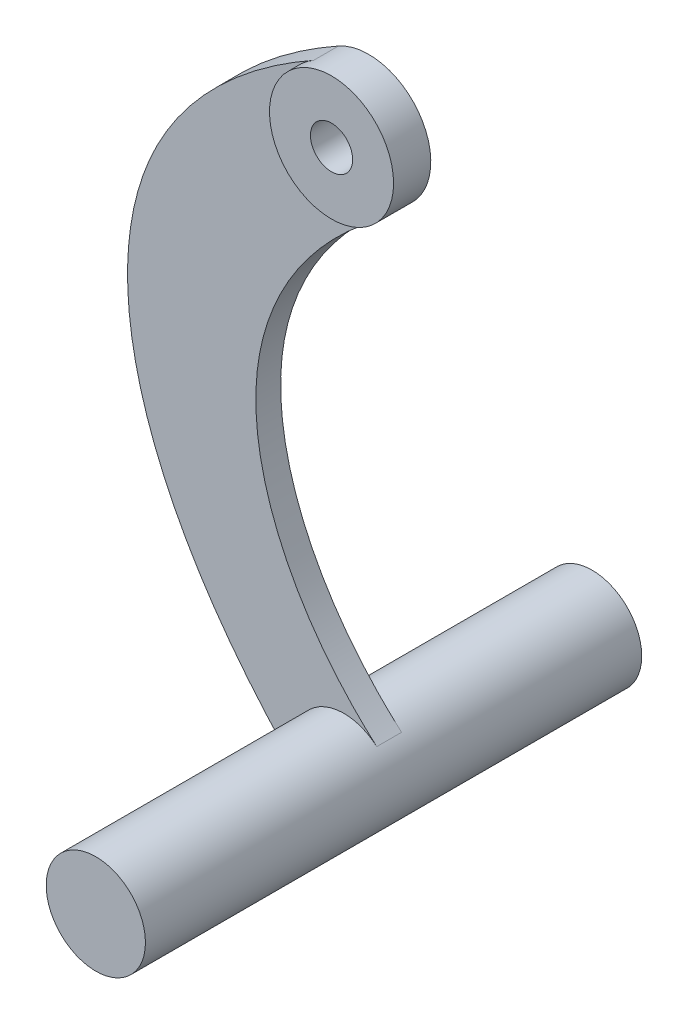
ISO-10303-21;
HEADER;
FILE_DESCRIPTION(('STEP AP214'),'2;1');
FILE_NAME('part.step','',(''),(''),'','','');
FILE_SCHEMA(('AUTOMOTIVE_DESIGN { 1 0 10303 214 1 1 1 1 }'));
ENDSEC;
DATA;
#1=APPLICATION_CONTEXT('core data for automotive mechanical design processes');
#2=APPLICATION_PROTOCOL_DEFINITION('international standard','automotive_design',2000,#1);
#3=PRODUCT_CONTEXT('',#1,'mechanical');
#4=PRODUCT('Part','Part','',(#3));
#5=PRODUCT_RELATED_PRODUCT_CATEGORY('part','',(#4));
#6=PRODUCT_DEFINITION_FORMATION('','',#4);
#7=PRODUCT_DEFINITION_CONTEXT('part definition',#1,'design');
#8=PRODUCT_DEFINITION('design','',#6,#7);
#9=PRODUCT_DEFINITION_SHAPE('','',#8);
#10=(LENGTH_UNIT() NAMED_UNIT(*) SI_UNIT(.MILLI.,.METRE.));
#11=(NAMED_UNIT(*) PLANE_ANGLE_UNIT() SI_UNIT($,.RADIAN.));
#12=(NAMED_UNIT(*) SI_UNIT($,.STERADIAN.) SOLID_ANGLE_UNIT());
#13=UNCERTAINTY_MEASURE_WITH_UNIT(LENGTH_MEASURE(1.E-05),#10,'distance_accuracy_value','');
#14=(GEOMETRIC_REPRESENTATION_CONTEXT(3) GLOBAL_UNCERTAINTY_ASSIGNED_CONTEXT((#13)) GLOBAL_UNIT_ASSIGNED_CONTEXT((#10,
#11,#12)) REPRESENTATION_CONTEXT('',''));
#15=CARTESIAN_POINT('',(0.,0.,0.));
#16=DIRECTION('',(0.,0.,1.));
#17=DIRECTION('',(1.,0.,0.));
#18=AXIS2_PLACEMENT_3D('',#15,#16,#17);
#19=CARTESIAN_POINT('',(0.,0.,2.5));
#20=DIRECTION('',(0.,0.,1.));
#21=DIRECTION('',(1.,0.,0.));
#22=AXIS2_PLACEMENT_3D('',#19,#20,#21);
#23=PLANE('',#22);
#24=CARTESIAN_POINT('',(0.,0.,2.5));
#25=DIRECTION('',(0.,0.,1.));
#26=DIRECTION('',(1.,0.,0.));
#27=AXIS2_PLACEMENT_3D('',#24,#25,#26);
#28=CIRCLE('',#27,12.5);
#29=CARTESIAN_POINT('',(12.5,0.,2.5));
#30=VERTEX_POINT('',#29);
#31=EDGE_CURVE('E44',#30,#30,#28,.T.);
#32=ORIENTED_EDGE('',*,*,#31,.T.);
#33=EDGE_LOOP('',(#32));
#34=FACE_BOUND('',#33,.T.);
#35=CARTESIAN_POINT('',(0.,0.,2.5));
#36=DIRECTION('',(0.,0.,1.));
#37=DIRECTION('',(1.,0.,0.));
#38=AXIS2_PLACEMENT_3D('',#35,#36,#37);
#39=CIRCLE('',#38,4.25);
#40=CARTESIAN_POINT('',(4.25,0.,2.5));
#41=VERTEX_POINT('',#40);
#42=EDGE_CURVE('E118',#41,#41,#39,.T.);
#43=ORIENTED_EDGE('',*,*,#42,.F.);
#44=EDGE_LOOP('',(#43));
#45=FACE_BOUND('',#44,.T.);
#46=ADVANCED_FACE('F35',(#34,#45),#23,.T.);
#47=CARTESIAN_POINT('',(0.,0.,2.5));
#48=DIRECTION('',(0.,0.,-1.));
#49=DIRECTION('',(-1.,0.,0.));
#50=AXIS2_PLACEMENT_3D('',#47,#48,#49);
#51=CYLINDRICAL_SURFACE('',#50,12.5);
#52=ORIENTED_EDGE('',*,*,#31,.F.);
#53=EDGE_LOOP('',(#52));
#54=FACE_BOUND('',#53,.T.);
#55=CARTESIAN_POINT('',(0.,0.,0.));
#56=DIRECTION('',(0.,0.,1.));
#57=DIRECTION('',(1.,0.,0.));
#58=AXIS2_PLACEMENT_3D('',#55,#56,#57);
#59=CIRCLE('',#58,12.5);
#60=CARTESIAN_POINT('',(-6.10639637499908,10.9069667328455,0.));
#61=VERTEX_POINT('',#60);
#62=CARTESIAN_POINT('',(7.40681903297774,-10.0692120750692,0.));
#63=VERTEX_POINT('',#62);
#64=EDGE_CURVE('E100',#61,#63,#59,.T.);
#65=ORIENTED_EDGE('',*,*,#64,.T.);
#66=DIRECTION('',(0.,0.,1.));
#67=VECTOR('',#66,1.);
#68=CARTESIAN_POINT('',(7.40681903297774,-10.0692120750692,-5.));
#69=LINE('',#68,#67);
#70=CARTESIAN_POINT('',(7.40681903297774,-10.0692120750692,-5.));
#71=VERTEX_POINT('',#70);
#72=EDGE_CURVE('E72',#71,#63,#69,.T.);
#73=ORIENTED_EDGE('',*,*,#72,.F.);
#74=CARTESIAN_POINT('',(0.,0.,-5.));
#75=DIRECTION('',(0.,0.,-1.));
#76=DIRECTION('',(-1.,0.,0.));
#77=AXIS2_PLACEMENT_3D('',#74,#75,#76);
#78=CIRCLE('',#77,12.5);
#79=CARTESIAN_POINT('',(-6.10639637499908,10.9069667328455,-5.));
#80=VERTEX_POINT('',#79);
#81=EDGE_CURVE('E59',#80,#71,#78,.T.);
#82=ORIENTED_EDGE('',*,*,#81,.F.);
#83=DIRECTION('',(0.,0.,1.));
#84=VECTOR('',#83,1.);
#85=CARTESIAN_POINT('',(-6.10639637499908,10.9069667328455,-5.));
#86=LINE('',#85,#84);
#87=EDGE_CURVE('E51',#80,#61,#86,.T.);
#88=ORIENTED_EDGE('',*,*,#87,.T.);
#89=EDGE_LOOP('',(#65,#73,#82,#88));
#90=FACE_BOUND('',#89,.T.);
#91=ADVANCED_FACE('F37',(#54,#90),#51,.T.);
#92=CARTESIAN_POINT('',(0.,0.,2.5));
#93=DIRECTION('',(0.,0.,-1.));
#94=DIRECTION('',(-1.,0.,0.));
#95=AXIS2_PLACEMENT_3D('',#92,#93,#94);
#96=CYLINDRICAL_SURFACE('',#95,4.25);
#97=ORIENTED_EDGE('',*,*,#42,.T.);
#98=EDGE_LOOP('',(#97));
#99=FACE_BOUND('',#98,.T.);
#100=CARTESIAN_POINT('',(0.,0.,-5.));
#101=DIRECTION('',(0.,0.,-1.));
#102=DIRECTION('',(-1.,0.,0.));
#103=AXIS2_PLACEMENT_3D('',#100,#101,#102);
#104=CIRCLE('',#103,4.25);
#105=CARTESIAN_POINT('',(-4.25,0.,-5.));
#106=VERTEX_POINT('',#105);
#107=EDGE_CURVE('E39',#106,#106,#104,.T.);
#108=ORIENTED_EDGE('',*,*,#107,.T.);
#109=EDGE_LOOP('',(#108));
#110=FACE_BOUND('',#109,.T.);
#111=ADVANCED_FACE('F145',(#99,#110),#96,.F.);
#112=CARTESIAN_POINT('',(7.40681903297774,-10.0692120750692,-5.));
#113=CARTESIAN_POINT('',(-7.97990750459092,-21.3875454385965,-5.));
#114=CARTESIAN_POINT('',(-26.8557304346869,-52.6462833363687,-5.));
#115=CARTESIAN_POINT('',(-9.43979398382765,-88.3540394934456,-5.));
#116=CARTESIAN_POINT('',(6.61109426102788,-102.497105047263,-5.));
#117=B_SPLINE_CURVE_WITH_KNOTS('',3,(#112,#113,#114,#115,#116),.UNSPECIFIED.,.F.,.F.,(4,1,4),
(0.,0.455821989151963,1.),.UNSPECIFIED.);
#118=DIRECTION('',(0.,0.,1.));
#119=VECTOR('',#118,1.);
#120=SURFACE_OF_LINEAR_EXTRUSION('',#117,#119);
#121=CARTESIAN_POINT('',(7.40681903297774,-10.0692120750692,0.));
#122=CARTESIAN_POINT('',(-7.97990750459092,-21.3875454385965,0.));
#123=CARTESIAN_POINT('',(-26.8557304346869,-52.6462833363687,0.));
#124=CARTESIAN_POINT('',(-9.43979398382765,-88.3540394934456,0.));
#125=CARTESIAN_POINT('',(6.61109426102788,-102.497105047263,0.));
#126=B_SPLINE_CURVE_WITH_KNOTS('',3,(#121,#122,#123,#124,#125),.UNSPECIFIED.,.F.,.F.,(4,1,4),
(0.,0.455821989151963,1.),.UNSPECIFIED.);
#127=CARTESIAN_POINT('',(6.61109426102789,-102.497105047263,0.));
#128=VERTEX_POINT('',#127);
#129=EDGE_CURVE('E102',#63,#128,#126,.T.);
#130=ORIENTED_EDGE('',*,*,#129,.T.);
#131=DIRECTION('',(0.,0.,1.));
#132=VECTOR('',#131,1.);
#133=CARTESIAN_POINT('',(6.61109426102789,-102.497105047263,-5.));
#134=LINE('',#133,#132);
#135=CARTESIAN_POINT('',(6.61109426102788,-102.497105047263,-5.));
#136=VERTEX_POINT('',#135);
#137=EDGE_CURVE('E90',#136,#128,#134,.T.);
#138=ORIENTED_EDGE('',*,*,#137,.F.);
#139=EDGE_CURVE('E101',#71,#136,#117,.T.);
#140=ORIENTED_EDGE('',*,*,#139,.F.);
#141=ORIENTED_EDGE('',*,*,#72,.T.);
#142=EDGE_LOOP('',(#130,#138,#140,#141));
#143=FACE_BOUND('',#142,.T.);
#144=ADVANCED_FACE('F123',(#143),#120,.F.);
#145=CARTESIAN_POINT('',(0.,-110.,-5.));
#146=DIRECTION('',(0.,0.,1.));
#147=DIRECTION('',(1.,0.,0.));
#148=AXIS2_PLACEMENT_3D('',#145,#146,#147);
#149=CYLINDRICAL_SURFACE('',#148,10.);
#150=ORIENTED_EDGE('',*,*,#137,.T.);
#151=CARTESIAN_POINT('',(0.,-110.,0.));
#152=DIRECTION('',(0.,0.,-1.));
#153=DIRECTION('',(-1.,0.,0.));
#154=AXIS2_PLACEMENT_3D('',#151,#152,#153);
#155=CIRCLE('',#154,10.);
#156=CARTESIAN_POINT('',(-7.00278738043043,-117.138695182208,0.));
#157=VERTEX_POINT('',#156);
#158=EDGE_CURVE('E11',#157,#128,#155,.T.);
#159=ORIENTED_EDGE('',*,*,#158,.F.);
#160=DIRECTION('',(0.,0.,1.));
#161=VECTOR('',#160,1.);
#162=CARTESIAN_POINT('',(-7.00278738043044,-117.138695182208,-5.));
#163=LINE('',#162,#161);
#164=CARTESIAN_POINT('',(-7.00278738043044,-117.138695182208,-5.));
#165=VERTEX_POINT('',#164);
#166=EDGE_CURVE('E88',#165,#157,#163,.T.);
#167=ORIENTED_EDGE('',*,*,#166,.F.);
#168=CARTESIAN_POINT('',(0.,-110.,-5.));
#169=DIRECTION('',(0.,0.,-1.));
#170=DIRECTION('',(-1.,0.,0.));
#171=AXIS2_PLACEMENT_3D('',#168,#169,#170);
#172=CIRCLE('',#171,10.);
#173=EDGE_CURVE('E76',#165,#136,#172,.T.);
#174=ORIENTED_EDGE('',*,*,#173,.T.);
#175=EDGE_LOOP('',(#150,#159,#167,#174));
#176=FACE_BOUND('',#175,.T.);
#177=CARTESIAN_POINT('',(0.,-110.,50.));
#178=DIRECTION('',(0.,0.,1.));
#179=DIRECTION('',(1.,0.,0.));
#180=AXIS2_PLACEMENT_3D('',#177,#178,#179);
#181=CIRCLE('',#180,10.);
#182=CARTESIAN_POINT('',(10.,-110.,50.));
#183=VERTEX_POINT('',#182);
#184=EDGE_CURVE('E128',#183,#183,#181,.T.);
#185=ORIENTED_EDGE('',*,*,#184,.F.);
#186=EDGE_LOOP('',(#185));
#187=FACE_BOUND('',#186,.T.);
#188=CARTESIAN_POINT('',(0.,-110.,-50.));
#189=DIRECTION('',(0.,0.,1.));
#190=DIRECTION('',(1.,0.,0.));
#191=AXIS2_PLACEMENT_3D('',#188,#189,#190);
#192=CIRCLE('',#191,10.);
#193=CARTESIAN_POINT('',(10.,-110.,-50.));
#194=VERTEX_POINT('',#193);
#195=EDGE_CURVE('E125',#194,#194,#192,.T.);
#196=ORIENTED_EDGE('',*,*,#195,.T.);
#197=EDGE_LOOP('',(#196));
#198=FACE_BOUND('',#197,.T.);
#199=ADVANCED_FACE('F86',(#176,#187,#198),#149,.T.);
#200=CARTESIAN_POINT('',(-7.00278738043044,-117.138695182208,-5.));
#201=CARTESIAN_POINT('',(-40.0030167539701,-84.7667302908812,-5.));
#202=CARTESIAN_POINT('',(-57.0301345845801,-32.0145116065053,-5.));
#203=CARTESIAN_POINT('',(-20.6217154745296,2.78039093020671,-5.));
#204=CARTESIAN_POINT('',(-6.10639637499908,10.9069667328455,-5.));
#205=B_SPLINE_CURVE_WITH_KNOTS('',3,(#200,#201,#202,#203,#204),.UNSPECIFIED.,.F.,.F.,(4,1,4),
(0.,0.697975810308502,1.),.UNSPECIFIED.);
#206=DIRECTION('',(0.,0.,1.));
#207=VECTOR('',#206,1.);
#208=SURFACE_OF_LINEAR_EXTRUSION('',#205,#207);
#209=CARTESIAN_POINT('',(-7.00278738043044,-117.138695182208,0.));
#210=CARTESIAN_POINT('',(-40.0030167539701,-84.7667302908812,0.));
#211=CARTESIAN_POINT('',(-57.0301345845801,-32.0145116065053,0.));
#212=CARTESIAN_POINT('',(-20.6217154745296,2.78039093020671,0.));
#213=CARTESIAN_POINT('',(-6.10639637499908,10.9069667328455,0.));
#214=B_SPLINE_CURVE_WITH_KNOTS('',3,(#209,#210,#211,#212,#213),.UNSPECIFIED.,.F.,.F.,(4,1,4),
(0.,0.697975810308502,1.),.UNSPECIFIED.);
#215=EDGE_CURVE('E95',#157,#61,#214,.T.);
#216=ORIENTED_EDGE('',*,*,#215,.T.);
#217=ORIENTED_EDGE('',*,*,#87,.F.);
#218=EDGE_CURVE('E97',#165,#80,#205,.T.);
#219=ORIENTED_EDGE('',*,*,#218,.F.);
#220=ORIENTED_EDGE('',*,*,#166,.T.);
#221=EDGE_LOOP('',(#216,#217,#219,#220));
#222=FACE_BOUND('',#221,.T.);
#223=ADVANCED_FACE('F94',(#222),#208,.F.);
#224=CARTESIAN_POINT('',(-17.746440588382,-55.2429098448485,-5.));
#225=DIRECTION('',(0.,0.,-1.));
#226=DIRECTION('',(-1.,0.,0.));
#227=AXIS2_PLACEMENT_3D('',#224,#225,#226);
#228=PLANE('',#227);
#229=ORIENTED_EDGE('',*,*,#107,.F.);
#230=EDGE_LOOP('',(#229));
#231=FACE_BOUND('',#230,.T.);
#232=ORIENTED_EDGE('',*,*,#173,.F.);
#233=ORIENTED_EDGE('',*,*,#218,.T.);
#234=ORIENTED_EDGE('',*,*,#81,.T.);
#235=ORIENTED_EDGE('',*,*,#139,.T.);
#236=EDGE_LOOP('',(#232,#233,#234,#235));
#237=FACE_BOUND('',#236,.T.);
#238=ADVANCED_FACE('F124',(#231,#237),#228,.T.);
#239=CARTESIAN_POINT('',(-17.746440588382,-55.2429098448485,0.));
#240=DIRECTION('',(0.,0.,-1.));
#241=DIRECTION('',(-1.,0.,0.));
#242=AXIS2_PLACEMENT_3D('',#239,#240,#241);
#243=PLANE('',#242);
#244=ORIENTED_EDGE('',*,*,#215,.F.);
#245=ORIENTED_EDGE('',*,*,#158,.T.);
#246=ORIENTED_EDGE('',*,*,#129,.F.);
#247=ORIENTED_EDGE('',*,*,#64,.F.);
#248=EDGE_LOOP('',(#244,#245,#246,#247));
#249=FACE_BOUND('',#248,.T.);
#250=ADVANCED_FACE('F99',(#249),#243,.F.);
#251=CARTESIAN_POINT('',(0.,-110.,50.));
#252=DIRECTION('',(0.,0.,1.));
#253=DIRECTION('',(1.,0.,0.));
#254=AXIS2_PLACEMENT_3D('',#251,#252,#253);
#255=PLANE('',#254);
#256=ORIENTED_EDGE('',*,*,#184,.T.);
#257=EDGE_LOOP('',(#256));
#258=FACE_BOUND('',#257,.T.);
#259=ADVANCED_FACE('F165',(#258),#255,.T.);
#260=CARTESIAN_POINT('',(0.,-110.,-50.));
#261=DIRECTION('',(0.,0.,1.));
#262=DIRECTION('',(1.,0.,0.));
#263=AXIS2_PLACEMENT_3D('',#260,#261,#262);
#264=PLANE('',#263);
#265=ORIENTED_EDGE('',*,*,#195,.F.);
#266=EDGE_LOOP('',(#265));
#267=FACE_BOUND('',#266,.T.);
#268=ADVANCED_FACE('F170',(#267),#264,.F.);
#269=CLOSED_SHELL('',(#46,#91,#111,#144,#199,#223,#238,#250,#259,#268));
#270=MANIFOLD_SOLID_BREP('B2',#269);
#271=ADVANCED_BREP_SHAPE_REPRESENTATION('',(#18,#270),#14);
#272=SHAPE_DEFINITION_REPRESENTATION(#9,#271);
ENDSEC;
END-ISO-10303-21;
